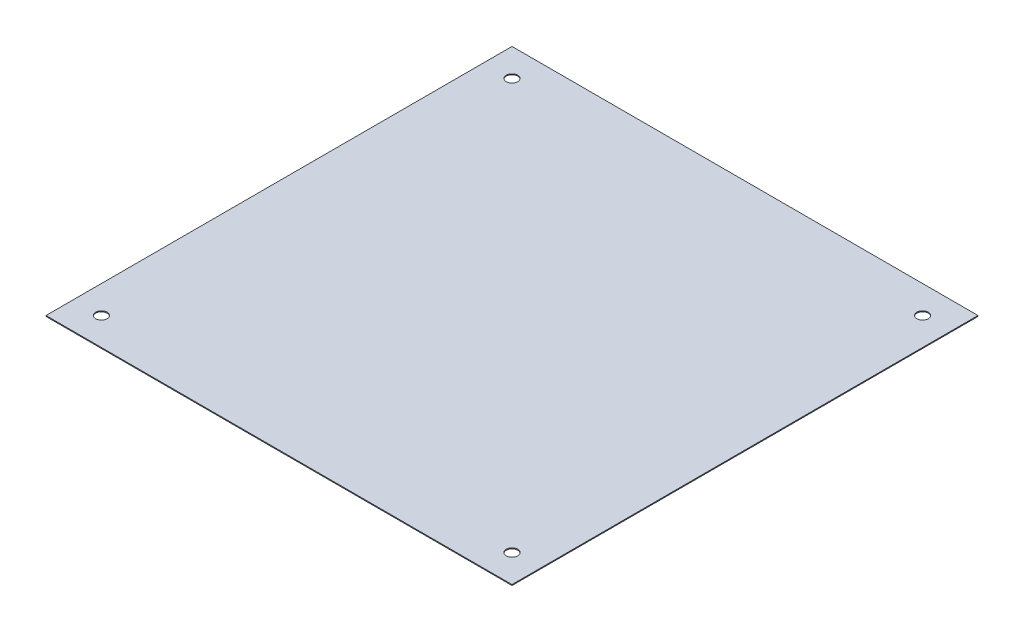
ISO-10303-21;
HEADER;
FILE_DESCRIPTION(('STEP AP214'),'2;1');
FILE_NAME('part.step','',(''),(''),'','','');
FILE_SCHEMA(('AUTOMOTIVE_DESIGN { 1 0 10303 214 1 1 1 1 }'));
ENDSEC;
DATA;
#1=APPLICATION_CONTEXT('core data for automotive mechanical design processes');
#2=APPLICATION_PROTOCOL_DEFINITION('international standard','automotive_design',2000,#1);
#3=PRODUCT_CONTEXT('',#1,'mechanical');
#4=PRODUCT('Part','Part','',(#3));
#5=PRODUCT_RELATED_PRODUCT_CATEGORY('part','',(#4));
#6=PRODUCT_DEFINITION_FORMATION('','',#4);
#7=PRODUCT_DEFINITION_CONTEXT('part definition',#1,'design');
#8=PRODUCT_DEFINITION('design','',#6,#7);
#9=PRODUCT_DEFINITION_SHAPE('','',#8);
#10=(LENGTH_UNIT() NAMED_UNIT(*) SI_UNIT(.MILLI.,.METRE.));
#11=(NAMED_UNIT(*) PLANE_ANGLE_UNIT() SI_UNIT($,.RADIAN.));
#12=(NAMED_UNIT(*) SI_UNIT($,.STERADIAN.) SOLID_ANGLE_UNIT());
#13=UNCERTAINTY_MEASURE_WITH_UNIT(LENGTH_MEASURE(1.E-05),#10,'distance_accuracy_value','');
#14=(GEOMETRIC_REPRESENTATION_CONTEXT(3) GLOBAL_UNCERTAINTY_ASSIGNED_CONTEXT((#13)) GLOBAL_UNIT_ASSIGNED_CONTEXT((#10,
#11,#12)) REPRESENTATION_CONTEXT('',''));
#15=CARTESIAN_POINT('',(0.,0.,0.));
#16=DIRECTION('',(0.,0.,1.));
#17=DIRECTION('',(1.,0.,0.));
#18=AXIS2_PLACEMENT_3D('',#15,#16,#17);
#19=CARTESIAN_POINT('',(0.,0.,0.));
#20=DIRECTION('',(0.,-1.,0.));
#21=DIRECTION('',(0.,0.,-1.));
#22=AXIS2_PLACEMENT_3D('',#19,#20,#21);
#23=PLANE('',#22);
#24=CARTESIAN_POINT('',(15.875,0.,-15.875));
#25=DIRECTION('',(0.,1.,0.));
#26=DIRECTION('',(0.,0.,1.));
#27=AXIS2_PLACEMENT_3D('',#24,#25,#26);
#28=CIRCLE('',#27,3.2639);
#29=CARTESIAN_POINT('',(15.875,0.,-12.6111));
#30=VERTEX_POINT('',#29);
#31=EDGE_CURVE('E130',#30,#30,#28,.T.);
#32=ORIENTED_EDGE('',*,*,#31,.T.);
#33=EDGE_LOOP('',(#32));
#34=FACE_BOUND('',#33,.T.);
#35=CARTESIAN_POINT('',(15.875,0.,-250.825));
#36=DIRECTION('',(0.,1.,0.));
#37=DIRECTION('',(0.,0.,1.));
#38=AXIS2_PLACEMENT_3D('',#35,#36,#37);
#39=CIRCLE('',#38,3.26390000000001);
#40=CARTESIAN_POINT('',(15.875,0.,-247.5611));
#41=VERTEX_POINT('',#40);
#42=EDGE_CURVE('E92',#41,#41,#39,.T.);
#43=ORIENTED_EDGE('',*,*,#42,.T.);
#44=EDGE_LOOP('',(#43));
#45=FACE_BOUND('',#44,.T.);
#46=DIRECTION('',(0.,0.,1.));
#47=VECTOR('',#46,1.);
#48=CARTESIAN_POINT('',(0.,0.,0.));
#49=LINE('',#48,#47);
#50=CARTESIAN_POINT('',(0.,0.,-266.7));
#51=VERTEX_POINT('',#50);
#52=CARTESIAN_POINT('',(0.,0.,0.));
#53=VERTEX_POINT('',#52);
#54=EDGE_CURVE('E88',#51,#53,#49,.T.);
#55=ORIENTED_EDGE('',*,*,#54,.F.);
#56=DIRECTION('',(-1.,0.,0.));
#57=VECTOR('',#56,1.);
#58=CARTESIAN_POINT('',(0.,0.,-266.7));
#59=LINE('',#58,#57);
#60=CARTESIAN_POINT('',(266.7,0.,-266.7));
#61=VERTEX_POINT('',#60);
#62=EDGE_CURVE('E103',#61,#51,#59,.T.);
#63=ORIENTED_EDGE('',*,*,#62,.F.);
#64=DIRECTION('',(0.,0.,-1.));
#65=VECTOR('',#64,1.);
#66=CARTESIAN_POINT('',(266.7,0.,0.));
#67=LINE('',#66,#65);
#68=CARTESIAN_POINT('',(266.7,0.,0.));
#69=VERTEX_POINT('',#68);
#70=EDGE_CURVE('E94',#69,#61,#67,.T.);
#71=ORIENTED_EDGE('',*,*,#70,.F.);
#72=DIRECTION('',(1.,0.,0.));
#73=VECTOR('',#72,1.);
#74=CARTESIAN_POINT('',(0.,0.,0.));
#75=LINE('',#74,#73);
#76=EDGE_CURVE('E91',#53,#69,#75,.T.);
#77=ORIENTED_EDGE('',*,*,#76,.F.);
#78=EDGE_LOOP('',(#55,#63,#71,#77));
#79=FACE_BOUND('',#78,.T.);
#80=CARTESIAN_POINT('',(250.825,0.,-250.825));
#81=DIRECTION('',(0.,1.,0.));
#82=DIRECTION('',(0.,0.,1.));
#83=AXIS2_PLACEMENT_3D('',#80,#81,#82);
#84=CIRCLE('',#83,3.26390000000001);
#85=CARTESIAN_POINT('',(250.825,0.,-247.5611));
#86=VERTEX_POINT('',#85);
#87=EDGE_CURVE('E97',#86,#86,#84,.T.);
#88=ORIENTED_EDGE('',*,*,#87,.T.);
#89=EDGE_LOOP('',(#88));
#90=FACE_BOUND('',#89,.T.);
#91=CARTESIAN_POINT('',(250.825,0.,-15.875));
#92=DIRECTION('',(0.,1.,0.));
#93=DIRECTION('',(0.,0.,1.));
#94=AXIS2_PLACEMENT_3D('',#91,#92,#93);
#95=CIRCLE('',#94,3.26390000000001);
#96=CARTESIAN_POINT('',(250.825,0.,-12.6111));
#97=VERTEX_POINT('',#96);
#98=EDGE_CURVE('E127',#97,#97,#95,.T.);
#99=ORIENTED_EDGE('',*,*,#98,.T.);
#100=EDGE_LOOP('',(#99));
#101=FACE_BOUND('',#100,.T.);
#102=ADVANCED_FACE('F34',(#34,#45,#79,#90,#101),#23,.T.);
#103=CARTESIAN_POINT('',(0.,5.588,0.));
#104=DIRECTION('',(1.,0.,0.));
#105=DIRECTION('',(0.,0.,-1.));
#106=AXIS2_PLACEMENT_3D('',#103,#104,#105);
#107=PLANE('',#106);
#108=DIRECTION('',(0.,-1.,0.));
#109=VECTOR('',#108,1.);
#110=CARTESIAN_POINT('',(0.,5.588,0.));
#111=LINE('',#110,#109);
#112=CARTESIAN_POINT('',(0.,0.508000000000008,0.));
#113=VERTEX_POINT('',#112);
#114=EDGE_CURVE('E12',#113,#53,#111,.T.);
#115=ORIENTED_EDGE('',*,*,#114,.F.);
#116=DIRECTION('',(0.,0.,1.));
#117=VECTOR('',#116,1.);
#118=CARTESIAN_POINT('',(0.,0.508000000000008,-266.7));
#119=LINE('',#118,#117);
#120=CARTESIAN_POINT('',(0.,0.508000000000008,-266.7));
#121=VERTEX_POINT('',#120);
#122=EDGE_CURVE('E74',#121,#113,#119,.T.);
#123=ORIENTED_EDGE('',*,*,#122,.F.);
#124=DIRECTION('',(0.,-1.,0.));
#125=VECTOR('',#124,1.);
#126=CARTESIAN_POINT('',(0.,5.588,-266.7));
#127=LINE('',#126,#125);
#128=EDGE_CURVE('E58',#121,#51,#127,.T.);
#129=ORIENTED_EDGE('',*,*,#128,.T.);
#130=ORIENTED_EDGE('',*,*,#54,.T.);
#131=EDGE_LOOP('',(#115,#123,#129,#130));
#132=FACE_BOUND('',#131,.T.);
#133=ADVANCED_FACE('F36',(#132),#107,.F.);
#134=CARTESIAN_POINT('',(0.,5.588,0.));
#135=DIRECTION('',(0.,0.,-1.));
#136=DIRECTION('',(-1.,0.,0.));
#137=AXIS2_PLACEMENT_3D('',#134,#135,#136);
#138=PLANE('',#137);
#139=DIRECTION('',(0.,-1.,0.));
#140=VECTOR('',#139,1.);
#141=CARTESIAN_POINT('',(266.7,5.588,0.));
#142=LINE('',#141,#140);
#143=CARTESIAN_POINT('',(266.7,0.508000000000008,0.));
#144=VERTEX_POINT('',#143);
#145=EDGE_CURVE('E43',#144,#69,#142,.T.);
#146=ORIENTED_EDGE('',*,*,#145,.F.);
#147=DIRECTION('',(1.,0.,0.));
#148=VECTOR('',#147,1.);
#149=CARTESIAN_POINT('',(0.,0.508000000000008,0.));
#150=LINE('',#149,#148);
#151=EDGE_CURVE('E77',#113,#144,#150,.T.);
#152=ORIENTED_EDGE('',*,*,#151,.F.);
#153=ORIENTED_EDGE('',*,*,#114,.T.);
#154=ORIENTED_EDGE('',*,*,#76,.T.);
#155=EDGE_LOOP('',(#146,#152,#153,#154));
#156=FACE_BOUND('',#155,.T.);
#157=ADVANCED_FACE('F83',(#156),#138,.F.);
#158=CARTESIAN_POINT('',(266.7,5.588,0.));
#159=DIRECTION('',(-1.,0.,0.));
#160=DIRECTION('',(0.,0.,1.));
#161=AXIS2_PLACEMENT_3D('',#158,#159,#160);
#162=PLANE('',#161);
#163=DIRECTION('',(0.,-1.,0.));
#164=VECTOR('',#163,1.);
#165=CARTESIAN_POINT('',(266.7,5.588,-266.7));
#166=LINE('',#165,#164);
#167=CARTESIAN_POINT('',(266.7,0.508000000000008,-266.7));
#168=VERTEX_POINT('',#167);
#169=EDGE_CURVE('E106',#168,#61,#166,.T.);
#170=ORIENTED_EDGE('',*,*,#169,.F.);
#171=DIRECTION('',(0.,0.,-1.));
#172=VECTOR('',#171,1.);
#173=CARTESIAN_POINT('',(266.7,0.508000000000008,0.));
#174=LINE('',#173,#172);
#175=EDGE_CURVE('E50',#144,#168,#174,.T.);
#176=ORIENTED_EDGE('',*,*,#175,.F.);
#177=ORIENTED_EDGE('',*,*,#145,.T.);
#178=ORIENTED_EDGE('',*,*,#70,.T.);
#179=EDGE_LOOP('',(#170,#176,#177,#178));
#180=FACE_BOUND('',#179,.T.);
#181=ADVANCED_FACE('F110',(#180),#162,.F.);
#182=CARTESIAN_POINT('',(0.,5.588,-266.7));
#183=DIRECTION('',(0.,0.,1.));
#184=DIRECTION('',(1.,0.,0.));
#185=AXIS2_PLACEMENT_3D('',#182,#183,#184);
#186=PLANE('',#185);
#187=ORIENTED_EDGE('',*,*,#128,.F.);
#188=DIRECTION('',(-1.,0.,0.));
#189=VECTOR('',#188,1.);
#190=CARTESIAN_POINT('',(266.7,0.508000000000008,-266.7));
#191=LINE('',#190,#189);
#192=EDGE_CURVE('E78',#168,#121,#191,.T.);
#193=ORIENTED_EDGE('',*,*,#192,.F.);
#194=ORIENTED_EDGE('',*,*,#169,.T.);
#195=ORIENTED_EDGE('',*,*,#62,.T.);
#196=EDGE_LOOP('',(#187,#193,#194,#195));
#197=FACE_BOUND('',#196,.T.);
#198=ADVANCED_FACE('F114',(#197),#186,.F.);
#199=CARTESIAN_POINT('',(15.875,5.588,-250.825));
#200=DIRECTION('',(0.,-1.,0.));
#201=DIRECTION('',(0.,0.,-1.));
#202=AXIS2_PLACEMENT_3D('',#199,#200,#201);
#203=CYLINDRICAL_SURFACE('',#202,3.26390000000001);
#204=CARTESIAN_POINT('',(15.875,0.508,-250.825));
#205=DIRECTION('',(0.,-1.,0.));
#206=DIRECTION('',(0.,0.,-1.));
#207=AXIS2_PLACEMENT_3D('',#204,#205,#206);
#208=CIRCLE('',#207,3.26390000000001);
#209=CARTESIAN_POINT('',(15.875,0.508,-254.0889));
#210=VERTEX_POINT('',#209);
#211=EDGE_CURVE('E124',#210,#210,#208,.T.);
#212=ORIENTED_EDGE('',*,*,#211,.F.);
#213=EDGE_LOOP('',(#212));
#214=FACE_BOUND('',#213,.T.);
#215=ORIENTED_EDGE('',*,*,#42,.F.);
#216=EDGE_LOOP('',(#215));
#217=FACE_BOUND('',#216,.T.);
#218=ADVANCED_FACE('F139',(#214,#217),#203,.F.);
#219=CARTESIAN_POINT('',(250.825,5.588,-250.825));
#220=DIRECTION('',(0.,-1.,0.));
#221=DIRECTION('',(0.,0.,-1.));
#222=AXIS2_PLACEMENT_3D('',#219,#220,#221);
#223=CYLINDRICAL_SURFACE('',#222,3.26390000000001);
#224=CARTESIAN_POINT('',(250.825,0.508,-250.825));
#225=DIRECTION('',(0.,-1.,0.));
#226=DIRECTION('',(0.,0.,-1.));
#227=AXIS2_PLACEMENT_3D('',#224,#225,#226);
#228=CIRCLE('',#227,3.26390000000001);
#229=CARTESIAN_POINT('',(250.825,0.508,-254.0889));
#230=VERTEX_POINT('',#229);
#231=EDGE_CURVE('E121',#230,#230,#228,.T.);
#232=ORIENTED_EDGE('',*,*,#231,.F.);
#233=EDGE_LOOP('',(#232));
#234=FACE_BOUND('',#233,.T.);
#235=ORIENTED_EDGE('',*,*,#87,.F.);
#236=EDGE_LOOP('',(#235));
#237=FACE_BOUND('',#236,.T.);
#238=ADVANCED_FACE('F136',(#234,#237),#223,.F.);
#239=CARTESIAN_POINT('',(15.875,5.588,-15.875));
#240=DIRECTION('',(0.,-1.,0.));
#241=DIRECTION('',(0.,0.,-1.));
#242=AXIS2_PLACEMENT_3D('',#239,#240,#241);
#243=CYLINDRICAL_SURFACE('',#242,3.2639);
#244=CARTESIAN_POINT('',(15.875,0.508,-15.875));
#245=DIRECTION('',(0.,-1.,0.));
#246=DIRECTION('',(0.,0.,-1.));
#247=AXIS2_PLACEMENT_3D('',#244,#245,#246);
#248=CIRCLE('',#247,3.2639);
#249=CARTESIAN_POINT('',(15.875,0.508,-19.1389));
#250=VERTEX_POINT('',#249);
#251=EDGE_CURVE('E118',#250,#250,#248,.T.);
#252=ORIENTED_EDGE('',*,*,#251,.F.);
#253=EDGE_LOOP('',(#252));
#254=FACE_BOUND('',#253,.T.);
#255=ORIENTED_EDGE('',*,*,#31,.F.);
#256=EDGE_LOOP('',(#255));
#257=FACE_BOUND('',#256,.T.);
#258=ADVANCED_FACE('F138',(#254,#257),#243,.F.);
#259=CARTESIAN_POINT('',(250.825,5.588,-15.875));
#260=DIRECTION('',(0.,-1.,0.));
#261=DIRECTION('',(0.,0.,-1.));
#262=AXIS2_PLACEMENT_3D('',#259,#260,#261);
#263=CYLINDRICAL_SURFACE('',#262,3.26390000000001);
#264=CARTESIAN_POINT('',(250.825,0.508,-15.875));
#265=DIRECTION('',(0.,-1.,0.));
#266=DIRECTION('',(0.,0.,-1.));
#267=AXIS2_PLACEMENT_3D('',#264,#265,#266);
#268=CIRCLE('',#267,3.26390000000001);
#269=CARTESIAN_POINT('',(250.825,0.508,-19.1389));
#270=VERTEX_POINT('',#269);
#271=EDGE_CURVE('E38',#270,#270,#268,.T.);
#272=ORIENTED_EDGE('',*,*,#271,.F.);
#273=EDGE_LOOP('',(#272));
#274=FACE_BOUND('',#273,.T.);
#275=ORIENTED_EDGE('',*,*,#98,.F.);
#276=EDGE_LOOP('',(#275));
#277=FACE_BOUND('',#276,.T.);
#278=ADVANCED_FACE('F146',(#274,#277),#263,.F.);
#279=CARTESIAN_POINT('',(0.,0.508,0.));
#280=DIRECTION('',(0.,-1.,0.));
#281=DIRECTION('',(0.,0.,-1.));
#282=AXIS2_PLACEMENT_3D('',#279,#280,#281);
#283=PLANE('',#282);
#284=ORIENTED_EDGE('',*,*,#211,.T.);
#285=EDGE_LOOP('',(#284));
#286=FACE_BOUND('',#285,.T.);
#287=ORIENTED_EDGE('',*,*,#231,.T.);
#288=EDGE_LOOP('',(#287));
#289=FACE_BOUND('',#288,.T.);
#290=ORIENTED_EDGE('',*,*,#251,.T.);
#291=EDGE_LOOP('',(#290));
#292=FACE_BOUND('',#291,.T.);
#293=ORIENTED_EDGE('',*,*,#271,.T.);
#294=EDGE_LOOP('',(#293));
#295=FACE_BOUND('',#294,.T.);
#296=ORIENTED_EDGE('',*,*,#151,.T.);
#297=ORIENTED_EDGE('',*,*,#175,.T.);
#298=ORIENTED_EDGE('',*,*,#192,.T.);
#299=ORIENTED_EDGE('',*,*,#122,.T.);
#300=EDGE_LOOP('',(#296,#297,#298,#299));
#301=FACE_BOUND('',#300,.T.);
#302=ADVANCED_FACE('F76',(#286,#289,#292,#295,#301),#283,.F.);
#303=CLOSED_SHELL('',(#102,#133,#157,#181,#198,#218,#238,#258,#278,#302));
#304=MANIFOLD_SOLID_BREP('B2',#303);
#305=ADVANCED_BREP_SHAPE_REPRESENTATION('',(#18,#304),#14);
#306=SHAPE_DEFINITION_REPRESENTATION(#9,#305);
ENDSEC;
END-ISO-10303-21;
